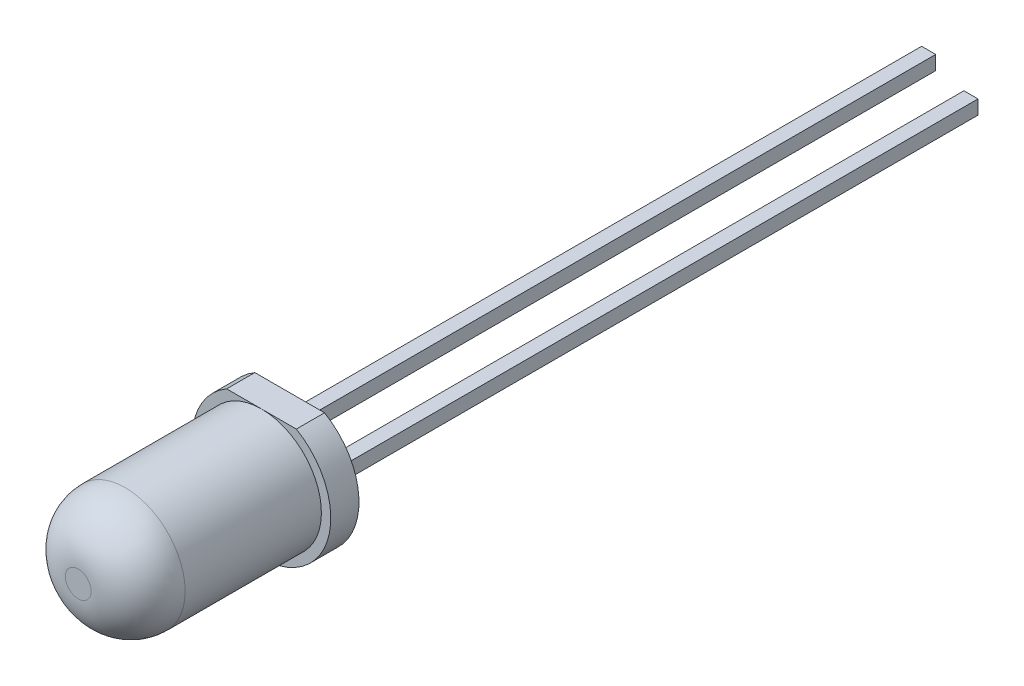
ISO-10303-21;
HEADER;
FILE_DESCRIPTION(('STEP AP214'),'2;1');
FILE_NAME('part.step','',(''),(''),'','','');
FILE_SCHEMA(('AUTOMOTIVE_DESIGN { 1 0 10303 214 1 1 1 1 }'));
ENDSEC;
DATA;
#1=APPLICATION_CONTEXT('core data for automotive mechanical design processes');
#2=APPLICATION_PROTOCOL_DEFINITION('international standard','automotive_design',2000,#1);
#3=PRODUCT_CONTEXT('',#1,'mechanical');
#4=PRODUCT('Part','Part','',(#3));
#5=PRODUCT_RELATED_PRODUCT_CATEGORY('part','',(#4));
#6=PRODUCT_DEFINITION_FORMATION('','',#4);
#7=PRODUCT_DEFINITION_CONTEXT('part definition',#1,'design');
#8=PRODUCT_DEFINITION('design','',#6,#7);
#9=PRODUCT_DEFINITION_SHAPE('','',#8);
#10=(LENGTH_UNIT() NAMED_UNIT(*) SI_UNIT(.MILLI.,.METRE.));
#11=(NAMED_UNIT(*) PLANE_ANGLE_UNIT() SI_UNIT($,.RADIAN.));
#12=(NAMED_UNIT(*) SI_UNIT($,.STERADIAN.) SOLID_ANGLE_UNIT());
#13=UNCERTAINTY_MEASURE_WITH_UNIT(LENGTH_MEASURE(1.E-05),#10,'distance_accuracy_value','');
#14=(GEOMETRIC_REPRESENTATION_CONTEXT(3) GLOBAL_UNCERTAINTY_ASSIGNED_CONTEXT((#13)) GLOBAL_UNIT_ASSIGNED_CONTEXT((#10,
#11,#12)) REPRESENTATION_CONTEXT('',''));
#15=CARTESIAN_POINT('',(0.,0.,0.));
#16=DIRECTION('',(0.,0.,1.));
#17=DIRECTION('',(1.,0.,0.));
#18=AXIS2_PLACEMENT_3D('',#15,#16,#17);
#19=CARTESIAN_POINT('',(-0.25,-0.5,3.3));
#20=DIRECTION('',(0.,0.,1.));
#21=DIRECTION('',(1.,0.,0.));
#22=AXIS2_PLACEMENT_3D('',#19,#20,#21);
#23=PLANE('',#22);
#24=DIRECTION('',(1.,0.,0.));
#25=VECTOR('',#24,1.);
#26=CARTESIAN_POINT('',(-0.25,-0.5,3.3));
#27=LINE('',#26,#25);
#28=CARTESIAN_POINT('',(-0.25,-0.5,3.3));
#29=VERTEX_POINT('',#28);
#30=CARTESIAN_POINT('',(0.25,-0.5,3.3));
#31=VERTEX_POINT('',#30);
#32=EDGE_CURVE('E55',#29,#31,#27,.T.);
#33=ORIENTED_EDGE('',*,*,#32,.T.);
#34=DIRECTION('',(0.,-1.,0.));
#35=VECTOR('',#34,1.);
#36=CARTESIAN_POINT('',(0.25,-0.5,3.3));
#37=LINE('',#36,#35);
#38=CARTESIAN_POINT('',(0.25,0.5,3.3));
#39=VERTEX_POINT('',#38);
#40=EDGE_CURVE('E92',#39,#31,#37,.T.);
#41=ORIENTED_EDGE('',*,*,#40,.F.);
#42=DIRECTION('',(1.,0.,0.));
#43=VECTOR('',#42,1.);
#44=CARTESIAN_POINT('',(-0.25,0.5,3.3));
#45=LINE('',#44,#43);
#46=CARTESIAN_POINT('',(-0.25,0.5,3.3));
#47=VERTEX_POINT('',#46);
#48=EDGE_CURVE('E12',#47,#39,#45,.T.);
#49=ORIENTED_EDGE('',*,*,#48,.F.);
#50=DIRECTION('',(0.,-1.,0.));
#51=VECTOR('',#50,1.);
#52=CARTESIAN_POINT('',(-0.25,-0.5,3.3));
#53=LINE('',#52,#51);
#54=EDGE_CURVE('E93',#47,#29,#53,.T.);
#55=ORIENTED_EDGE('',*,*,#54,.T.);
#56=EDGE_LOOP('',(#33,#41,#49,#55));
#57=FACE_BOUND('',#56,.T.);
#58=ADVANCED_FACE('F52',(#57),#23,.T.);
#59=CARTESIAN_POINT('',(-0.25,0.5,3.1));
#60=DIRECTION('',(0.,1.,0.));
#61=DIRECTION('',(0.,0.,1.));
#62=AXIS2_PLACEMENT_3D('',#59,#60,#61);
#63=PLANE('',#62);
#64=ORIENTED_EDGE('',*,*,#48,.T.);
#65=DIRECTION('',(0.,0.,1.));
#66=VECTOR('',#65,1.);
#67=CARTESIAN_POINT('',(0.25,0.5,3.1));
#68=LINE('',#67,#66);
#69=CARTESIAN_POINT('',(0.25,0.5,3.1));
#70=VERTEX_POINT('',#69);
#71=EDGE_CURVE('E109',#70,#39,#68,.T.);
#72=ORIENTED_EDGE('',*,*,#71,.F.);
#73=DIRECTION('',(1.,0.,0.));
#74=VECTOR('',#73,1.);
#75=CARTESIAN_POINT('',(-0.25,0.5,3.1));
#76=LINE('',#75,#74);
#77=CARTESIAN_POINT('',(-0.25,0.5,3.1));
#78=VERTEX_POINT('',#77);
#79=EDGE_CURVE('E60',#78,#70,#76,.T.);
#80=ORIENTED_EDGE('',*,*,#79,.F.);
#81=DIRECTION('',(0.,0.,1.));
#82=VECTOR('',#81,1.);
#83=CARTESIAN_POINT('',(-0.25,0.5,3.1));
#84=LINE('',#83,#82);
#85=EDGE_CURVE('E98',#78,#47,#84,.T.);
#86=ORIENTED_EDGE('',*,*,#85,.T.);
#87=EDGE_LOOP('',(#64,#72,#80,#86));
#88=FACE_BOUND('',#87,.T.);
#89=ADVANCED_FACE('F124',(#88),#63,.T.);
#90=CARTESIAN_POINT('',(-0.25,-0.5,3.1));
#91=DIRECTION('',(0.,0.,-1.));
#92=DIRECTION('',(-1.,0.,0.));
#93=AXIS2_PLACEMENT_3D('',#90,#91,#92);
#94=PLANE('',#93);
#95=ORIENTED_EDGE('',*,*,#79,.T.);
#96=DIRECTION('',(0.,1.,0.));
#97=VECTOR('',#96,1.);
#98=CARTESIAN_POINT('',(0.25,-0.5,3.1));
#99=LINE('',#98,#97);
#100=CARTESIAN_POINT('',(0.25,-0.5,3.1));
#101=VERTEX_POINT('',#100);
#102=EDGE_CURVE('E105',#101,#70,#99,.T.);
#103=ORIENTED_EDGE('',*,*,#102,.F.);
#104=DIRECTION('',(1.,0.,0.));
#105=VECTOR('',#104,1.);
#106=CARTESIAN_POINT('',(-0.25,-0.5,3.1));
#107=LINE('',#106,#105);
#108=CARTESIAN_POINT('',(-0.25,-0.5,3.1));
#109=VERTEX_POINT('',#108);
#110=EDGE_CURVE('E97',#109,#101,#107,.T.);
#111=ORIENTED_EDGE('',*,*,#110,.F.);
#112=DIRECTION('',(0.,1.,0.));
#113=VECTOR('',#112,1.);
#114=CARTESIAN_POINT('',(-0.25,-0.5,3.1));
#115=LINE('',#114,#113);
#116=EDGE_CURVE('E117',#109,#78,#115,.T.);
#117=ORIENTED_EDGE('',*,*,#116,.T.);
#118=EDGE_LOOP('',(#95,#103,#111,#117));
#119=FACE_BOUND('',#118,.T.);
#120=ADVANCED_FACE('F121',(#119),#94,.T.);
#121=CARTESIAN_POINT('',(-0.25,-0.5,3.1));
#122=DIRECTION('',(0.,-1.,0.));
#123=DIRECTION('',(0.,0.,-1.));
#124=AXIS2_PLACEMENT_3D('',#121,#122,#123);
#125=PLANE('',#124);
#126=ORIENTED_EDGE('',*,*,#110,.T.);
#127=DIRECTION('',(0.,0.,-1.));
#128=VECTOR('',#127,1.);
#129=CARTESIAN_POINT('',(0.25,-0.5,3.1));
#130=LINE('',#129,#128);
#131=EDGE_CURVE('E100',#31,#101,#130,.T.);
#132=ORIENTED_EDGE('',*,*,#131,.F.);
#133=ORIENTED_EDGE('',*,*,#32,.F.);
#134=DIRECTION('',(0.,0.,-1.));
#135=VECTOR('',#134,1.);
#136=CARTESIAN_POINT('',(-0.25,-0.5,3.1));
#137=LINE('',#136,#135);
#138=EDGE_CURVE('E115',#29,#109,#137,.T.);
#139=ORIENTED_EDGE('',*,*,#138,.T.);
#140=EDGE_LOOP('',(#126,#132,#133,#139));
#141=FACE_BOUND('',#140,.T.);
#142=ADVANCED_FACE('F101',(#141),#125,.T.);
#143=CARTESIAN_POINT('',(-0.25,0.,0.));
#144=DIRECTION('',(1.,0.,0.));
#145=DIRECTION('',(0.,0.,-1.));
#146=AXIS2_PLACEMENT_3D('',#143,#144,#145);
#147=PLANE('',#146);
#148=ORIENTED_EDGE('',*,*,#54,.F.);
#149=ORIENTED_EDGE('',*,*,#85,.F.);
#150=ORIENTED_EDGE('',*,*,#116,.F.);
#151=ORIENTED_EDGE('',*,*,#138,.F.);
#152=EDGE_LOOP('',(#148,#149,#150,#151));
#153=FACE_BOUND('',#152,.T.);
#154=ADVANCED_FACE('F126',(#153),#147,.F.);
#155=CARTESIAN_POINT('',(0.25,0.,0.));
#156=DIRECTION('',(1.,0.,0.));
#157=DIRECTION('',(0.,0.,-1.));
#158=AXIS2_PLACEMENT_3D('',#155,#156,#157);
#159=PLANE('',#158);
#160=ORIENTED_EDGE('',*,*,#40,.T.);
#161=ORIENTED_EDGE('',*,*,#131,.T.);
#162=ORIENTED_EDGE('',*,*,#102,.T.);
#163=ORIENTED_EDGE('',*,*,#71,.T.);
#164=EDGE_LOOP('',(#160,#161,#162,#163));
#165=FACE_BOUND('',#164,.T.);
#166=ADVANCED_FACE('F108',(#165),#159,.T.);
#167=CLOSED_SHELL('',(#58,#89,#120,#142,#154,#166));
#168=MANIFOLD_SOLID_BREP('B2',#167);
#169=CARTESIAN_POINT('',(0.,0.,1.2));
#170=DIRECTION('',(0.,0.,-1.));
#171=DIRECTION('',(-1.,0.,0.));
#172=AXIS2_PLACEMENT_3D('',#169,#170,#171);
#173=CYLINDRICAL_SURFACE('',#172,2.95);
#174=CARTESIAN_POINT('',(0.,0.,1.2));
#175=DIRECTION('',(0.,0.,1.));
#176=DIRECTION('',(1.,0.,0.));
#177=AXIS2_PLACEMENT_3D('',#174,#175,#176);
#178=CIRCLE('',#177,2.95);
#179=CARTESIAN_POINT('',(-1.48323969741914,2.55,1.2));
#180=VERTEX_POINT('',#179);
#181=CARTESIAN_POINT('',(1.48323969741914,2.55,1.2));
#182=VERTEX_POINT('',#181);
#183=EDGE_CURVE('E373',#180,#182,#178,.T.);
#184=ORIENTED_EDGE('',*,*,#183,.F.);
#185=DIRECTION('',(0.,0.,-1.));
#186=VECTOR('',#185,1.);
#187=CARTESIAN_POINT('',(-1.48323969741914,2.55,1.2));
#188=LINE('',#187,#186);
#189=CARTESIAN_POINT('',(-1.48323969741914,2.55,0.));
#190=VERTEX_POINT('',#189);
#191=EDGE_CURVE('E363',#180,#190,#188,.T.);
#192=ORIENTED_EDGE('',*,*,#191,.T.);
#193=CARTESIAN_POINT('',(0.,0.,0.));
#194=DIRECTION('',(0.,0.,1.));
#195=DIRECTION('',(1.,0.,0.));
#196=AXIS2_PLACEMENT_3D('',#193,#194,#195);
#197=CIRCLE('',#196,2.95);
#198=CARTESIAN_POINT('',(1.48323969741914,2.55,0.));
#199=VERTEX_POINT('',#198);
#200=EDGE_CURVE('E367',#190,#199,#197,.T.);
#201=ORIENTED_EDGE('',*,*,#200,.T.);
#202=DIRECTION('',(0.,0.,-1.));
#203=VECTOR('',#202,1.);
#204=CARTESIAN_POINT('',(1.48323969741914,2.55,1.2));
#205=LINE('',#204,#203);
#206=EDGE_CURVE('E359',#199,#182,#205,.F.);
#207=ORIENTED_EDGE('',*,*,#206,.T.);
#208=EDGE_LOOP('',(#184,#192,#201,#207));
#209=FACE_BOUND('',#208,.T.);
#210=ADVANCED_FACE('F192',(#209),#173,.T.);
#211=CARTESIAN_POINT('',(0.,0.,1.2));
#212=DIRECTION('',(0.,0.,1.));
#213=DIRECTION('',(1.,0.,0.));
#214=AXIS2_PLACEMENT_3D('',#211,#212,#213);
#215=PLANE('',#214);
#216=DIRECTION('',(1.,0.,0.));
#217=VECTOR('',#216,1.);
#218=CARTESIAN_POINT('',(-2.141777441338,2.55,1.2));
#219=LINE('',#218,#217);
#220=CARTESIAN_POINT('',(0.,2.55,1.2));
#221=VERTEX_POINT('',#220);
#222=EDGE_CURVE('E358',#180,#221,#219,.T.);
#223=ORIENTED_EDGE('',*,*,#222,.F.);
#224=ORIENTED_EDGE('',*,*,#183,.T.);
#225=EDGE_CURVE('E355',#221,#182,#219,.T.);
#226=ORIENTED_EDGE('',*,*,#225,.F.);
#227=CARTESIAN_POINT('',(0.,0.,1.2));
#228=DIRECTION('',(0.,0.,1.));
#229=DIRECTION('',(1.,0.,0.));
#230=AXIS2_PLACEMENT_3D('',#227,#228,#229);
#231=CIRCLE('',#230,2.55);
#232=EDGE_CURVE('E368',#221,#221,#231,.T.);
#233=ORIENTED_EDGE('',*,*,#232,.F.);
#234=EDGE_LOOP('',(#223,#224,#226,#233));
#235=FACE_BOUND('',#234,.T.);
#236=ADVANCED_FACE('F399',(#235),#215,.T.);
#237=CARTESIAN_POINT('',(0.,0.,0.));
#238=DIRECTION('',(0.,0.,1.));
#239=DIRECTION('',(1.,0.,0.));
#240=AXIS2_PLACEMENT_3D('',#237,#238,#239);
#241=PLANE('',#240);
#242=DIRECTION('',(0.,1.,0.));
#243=VECTOR('',#242,1.);
#244=CARTESIAN_POINT('',(0.3,0.97,0.));
#245=LINE('',#244,#243);
#246=CARTESIAN_POINT('',(0.3,0.97,0.));
#247=VERTEX_POINT('',#246);
#248=CARTESIAN_POINT('',(0.3,1.57,0.));
#249=VERTEX_POINT('',#248);
#250=EDGE_CURVE('E290',#247,#249,#245,.T.);
#251=ORIENTED_EDGE('',*,*,#250,.T.);
#252=DIRECTION('',(-1.,0.,0.));
#253=VECTOR('',#252,1.);
#254=CARTESIAN_POINT('',(0.3,1.57,0.));
#255=LINE('',#254,#253);
#256=CARTESIAN_POINT('',(-0.3,1.57,0.));
#257=VERTEX_POINT('',#256);
#258=EDGE_CURVE('E310',#249,#257,#255,.T.);
#259=ORIENTED_EDGE('',*,*,#258,.T.);
#260=DIRECTION('',(0.,1.,0.));
#261=VECTOR('',#260,1.);
#262=CARTESIAN_POINT('',(-0.3,0.97,0.));
#263=LINE('',#262,#261);
#264=CARTESIAN_POINT('',(-0.3,0.97,0.));
#265=VERTEX_POINT('',#264);
#266=EDGE_CURVE('E288',#265,#257,#263,.T.);
#267=ORIENTED_EDGE('',*,*,#266,.F.);
#268=DIRECTION('',(-1.,0.,0.));
#269=VECTOR('',#268,1.);
#270=CARTESIAN_POINT('',(0.3,0.97,0.));
#271=LINE('',#270,#269);
#272=EDGE_CURVE('E295',#247,#265,#271,.T.);
#273=ORIENTED_EDGE('',*,*,#272,.F.);
#274=EDGE_LOOP('',(#251,#259,#267,#273));
#275=FACE_BOUND('',#274,.T.);
#276=DIRECTION('',(0.,-1.,0.));
#277=VECTOR('',#276,1.);
#278=CARTESIAN_POINT('',(0.3,0.,0.));
#279=LINE('',#278,#277);
#280=CARTESIAN_POINT('',(0.3,-0.97,0.));
#281=VERTEX_POINT('',#280);
#282=CARTESIAN_POINT('',(0.3,-1.57,0.));
#283=VERTEX_POINT('',#282);
#284=EDGE_CURVE('E333',#281,#283,#279,.T.);
#285=ORIENTED_EDGE('',*,*,#284,.F.);
#286=DIRECTION('',(-1.,0.,0.));
#287=VECTOR('',#286,1.);
#288=CARTESIAN_POINT('',(0.,-0.97,0.));
#289=LINE('',#288,#287);
#290=CARTESIAN_POINT('',(-0.3,-0.97,0.));
#291=VERTEX_POINT('',#290);
#292=EDGE_CURVE('E313',#281,#291,#289,.T.);
#293=ORIENTED_EDGE('',*,*,#292,.T.);
#294=DIRECTION('',(0.,-1.,0.));
#295=VECTOR('',#294,1.);
#296=CARTESIAN_POINT('',(-0.3,0.,0.));
#297=LINE('',#296,#295);
#298=CARTESIAN_POINT('',(-0.3,-1.57,0.));
#299=VERTEX_POINT('',#298);
#300=EDGE_CURVE('E319',#291,#299,#297,.T.);
#301=ORIENTED_EDGE('',*,*,#300,.T.);
#302=DIRECTION('',(-1.,0.,0.));
#303=VECTOR('',#302,1.);
#304=CARTESIAN_POINT('',(0.,-1.57,0.));
#305=LINE('',#304,#303);
#306=EDGE_CURVE('E336',#283,#299,#305,.T.);
#307=ORIENTED_EDGE('',*,*,#306,.F.);
#308=EDGE_LOOP('',(#285,#293,#301,#307));
#309=FACE_BOUND('',#308,.T.);
#310=ORIENTED_EDGE('',*,*,#200,.F.);
#311=DIRECTION('',(1.,0.,0.));
#312=VECTOR('',#311,1.);
#313=CARTESIAN_POINT('',(0.,2.55,0.));
#314=LINE('',#313,#312);
#315=EDGE_CURVE('E201',#190,#199,#314,.T.);
#316=ORIENTED_EDGE('',*,*,#315,.T.);
#317=EDGE_LOOP('',(#310,#316));
#318=FACE_BOUND('',#317,.T.);
#319=ADVANCED_FACE('F390',(#275,#309,#318),#241,.F.);
#320=CARTESIAN_POINT('',(0.,0.,9.));
#321=DIRECTION('',(0.,0.,-1.));
#322=DIRECTION('',(-1.,0.,0.));
#323=AXIS2_PLACEMENT_3D('',#320,#321,#322);
#324=CYLINDRICAL_SURFACE('',#323,2.55);
#325=CARTESIAN_POINT('',(0.,0.,7.));
#326=DIRECTION('',(0.,0.,1.));
#327=DIRECTION('',(1.,0.,0.));
#328=AXIS2_PLACEMENT_3D('',#325,#326,#327);
#329=CIRCLE('',#328,2.55);
#330=CARTESIAN_POINT('',(2.55,0.,7.));
#331=VERTEX_POINT('',#330);
#332=EDGE_CURVE('E383',#331,#331,#329,.F.);
#333=ORIENTED_EDGE('',*,*,#332,.T.);
#334=EDGE_LOOP('',(#333));
#335=FACE_BOUND('',#334,.T.);
#336=ORIENTED_EDGE('',*,*,#232,.T.);
#337=EDGE_LOOP('',(#336));
#338=FACE_BOUND('',#337,.T.);
#339=ADVANCED_FACE('F402',(#335,#338),#324,.T.);
#340=CARTESIAN_POINT('',(0.,0.,9.));
#341=DIRECTION('',(0.,0.,1.));
#342=DIRECTION('',(1.,0.,0.));
#343=AXIS2_PLACEMENT_3D('',#340,#341,#342);
#344=PLANE('',#343);
#345=CARTESIAN_POINT('',(0.,0.,9.));
#346=DIRECTION('',(0.,0.,1.));
#347=DIRECTION('',(1.,0.,0.));
#348=AXIS2_PLACEMENT_3D('',#345,#346,#347);
#349=CIRCLE('',#348,0.55);
#350=CARTESIAN_POINT('',(0.55,0.,9.));
#351=VERTEX_POINT('',#350);
#352=EDGE_CURVE('E372',#351,#351,#349,.T.);
#353=ORIENTED_EDGE('',*,*,#352,.T.);
#354=EDGE_LOOP('',(#353));
#355=FACE_BOUND('',#354,.T.);
#356=ADVANCED_FACE('F404',(#355),#344,.T.);
#357=CARTESIAN_POINT('',(0.,0.,7.));
#358=DIRECTION('',(0.,0.,1.));
#359=DIRECTION('',(1.,0.,0.));
#360=AXIS2_PLACEMENT_3D('',#357,#358,#359);
#361=DEGENERATE_TOROIDAL_SURFACE('',#360,0.55,2.,.T.);
#362=ORIENTED_EDGE('',*,*,#332,.F.);
#363=EDGE_LOOP('',(#362));
#364=FACE_BOUND('',#363,.T.);
#365=ORIENTED_EDGE('',*,*,#352,.F.);
#366=EDGE_LOOP('',(#365));
#367=FACE_BOUND('',#366,.T.);
#368=ADVANCED_FACE('F194',(#364,#367),#361,.T.);
#369=CARTESIAN_POINT('',(-2.141777441338,2.55,-6.6));
#370=DIRECTION('',(0.,-1.,0.));
#371=DIRECTION('',(0.,0.,-1.));
#372=AXIS2_PLACEMENT_3D('',#369,#370,#371);
#373=PLANE('',#372);
#374=ORIENTED_EDGE('',*,*,#222,.T.);
#375=ORIENTED_EDGE('',*,*,#225,.T.);
#376=ORIENTED_EDGE('',*,*,#206,.F.);
#377=ORIENTED_EDGE('',*,*,#315,.F.);
#378=ORIENTED_EDGE('',*,*,#191,.F.);
#379=EDGE_LOOP('',(#374,#375,#376,#377,#378));
#380=FACE_BOUND('',#379,.T.);
#381=ADVANCED_FACE('F395',(#380),#373,.F.);
#382=CARTESIAN_POINT('',(0.,-0.97,-29.));
#383=DIRECTION('',(0.,1.,0.));
#384=DIRECTION('',(0.,0.,1.));
#385=AXIS2_PLACEMENT_3D('',#382,#383,#384);
#386=PLANE('',#385);
#387=ORIENTED_EDGE('',*,*,#292,.F.);
#388=DIRECTION('',(0.,0.,1.));
#389=VECTOR('',#388,1.);
#390=CARTESIAN_POINT('',(0.3,-0.97,-29.));
#391=LINE('',#390,#389);
#392=CARTESIAN_POINT('',(0.3,-0.97,-29.));
#393=VERTEX_POINT('',#392);
#394=EDGE_CURVE('E352',#393,#281,#391,.T.);
#395=ORIENTED_EDGE('',*,*,#394,.F.);
#396=DIRECTION('',(-1.,0.,0.));
#397=VECTOR('',#396,1.);
#398=CARTESIAN_POINT('',(0.,-0.97,-29.));
#399=LINE('',#398,#397);
#400=CARTESIAN_POINT('',(-0.3,-0.97,-29.));
#401=VERTEX_POINT('',#400);
#402=EDGE_CURVE('E314',#393,#401,#399,.T.);
#403=ORIENTED_EDGE('',*,*,#402,.T.);
#404=DIRECTION('',(0.,0.,1.));
#405=VECTOR('',#404,1.);
#406=CARTESIAN_POINT('',(-0.3,-0.97,-29.));
#407=LINE('',#406,#405);
#408=EDGE_CURVE('E329',#401,#291,#407,.T.);
#409=ORIENTED_EDGE('',*,*,#408,.T.);
#410=EDGE_LOOP('',(#387,#395,#403,#409));
#411=FACE_BOUND('',#410,.T.);
#412=ADVANCED_FACE('F436',(#411),#386,.T.);
#413=CARTESIAN_POINT('',(0.3,0.,-29.));
#414=DIRECTION('',(-1.,0.,0.));
#415=DIRECTION('',(0.,-1.,0.));
#416=AXIS2_PLACEMENT_3D('',#413,#414,#415);
#417=PLANE('',#416);
#418=ORIENTED_EDGE('',*,*,#284,.T.);
#419=DIRECTION('',(0.,0.,1.));
#420=VECTOR('',#419,1.);
#421=CARTESIAN_POINT('',(0.3,-1.57,-29.));
#422=LINE('',#421,#420);
#423=CARTESIAN_POINT('',(0.3,-1.57,-29.));
#424=VERTEX_POINT('',#423);
#425=EDGE_CURVE('E348',#424,#283,#422,.T.);
#426=ORIENTED_EDGE('',*,*,#425,.F.);
#427=DIRECTION('',(0.,-1.,0.));
#428=VECTOR('',#427,1.);
#429=CARTESIAN_POINT('',(0.3,0.,-29.));
#430=LINE('',#429,#428);
#431=EDGE_CURVE('E318',#393,#424,#430,.T.);
#432=ORIENTED_EDGE('',*,*,#431,.F.);
#433=ORIENTED_EDGE('',*,*,#394,.T.);
#434=EDGE_LOOP('',(#418,#426,#432,#433));
#435=FACE_BOUND('',#434,.T.);
#436=ADVANCED_FACE('F441',(#435),#417,.F.);
#437=CARTESIAN_POINT('',(0.,-1.57,-29.));
#438=DIRECTION('',(0.,1.,0.));
#439=DIRECTION('',(0.,0.,1.));
#440=AXIS2_PLACEMENT_3D('',#437,#438,#439);
#441=PLANE('',#440);
#442=ORIENTED_EDGE('',*,*,#306,.T.);
#443=DIRECTION('',(0.,0.,1.));
#444=VECTOR('',#443,1.);
#445=CARTESIAN_POINT('',(-0.3,-1.57,-29.));
#446=LINE('',#445,#444);
#447=CARTESIAN_POINT('',(-0.3,-1.57,-29.));
#448=VERTEX_POINT('',#447);
#449=EDGE_CURVE('E344',#448,#299,#446,.T.);
#450=ORIENTED_EDGE('',*,*,#449,.F.);
#451=DIRECTION('',(-1.,0.,0.));
#452=VECTOR('',#451,1.);
#453=CARTESIAN_POINT('',(0.,-1.57,-29.));
#454=LINE('',#453,#452);
#455=EDGE_CURVE('E322',#424,#448,#454,.T.);
#456=ORIENTED_EDGE('',*,*,#455,.F.);
#457=ORIENTED_EDGE('',*,*,#425,.T.);
#458=EDGE_LOOP('',(#442,#450,#456,#457));
#459=FACE_BOUND('',#458,.T.);
#460=ADVANCED_FACE('F451',(#459),#441,.F.);
#461=CARTESIAN_POINT('',(-0.3,0.,-29.));
#462=DIRECTION('',(-1.,0.,0.));
#463=DIRECTION('',(0.,-1.,0.));
#464=AXIS2_PLACEMENT_3D('',#461,#462,#463);
#465=PLANE('',#464);
#466=ORIENTED_EDGE('',*,*,#300,.F.);
#467=ORIENTED_EDGE('',*,*,#408,.F.);
#468=DIRECTION('',(0.,-1.,0.));
#469=VECTOR('',#468,1.);
#470=CARTESIAN_POINT('',(-0.3,0.,-29.));
#471=LINE('',#470,#469);
#472=EDGE_CURVE('E325',#401,#448,#471,.T.);
#473=ORIENTED_EDGE('',*,*,#472,.T.);
#474=ORIENTED_EDGE('',*,*,#449,.T.);
#475=EDGE_LOOP('',(#466,#467,#473,#474));
#476=FACE_BOUND('',#475,.T.);
#477=ADVANCED_FACE('F461',(#476),#465,.T.);
#478=CARTESIAN_POINT('',(0.,0.,-29.));
#479=DIRECTION('',(0.,0.,-1.));
#480=DIRECTION('',(-1.,0.,0.));
#481=AXIS2_PLACEMENT_3D('',#478,#479,#480);
#482=PLANE('',#481);
#483=ORIENTED_EDGE('',*,*,#402,.F.);
#484=ORIENTED_EDGE('',*,*,#431,.T.);
#485=ORIENTED_EDGE('',*,*,#455,.T.);
#486=ORIENTED_EDGE('',*,*,#472,.F.);
#487=EDGE_LOOP('',(#483,#484,#485,#486));
#488=FACE_BOUND('',#487,.T.);
#489=ADVANCED_FACE('F471',(#488),#482,.T.);
#490=CARTESIAN_POINT('',(0.3,1.57,-29.));
#491=DIRECTION('',(0.,1.,0.));
#492=DIRECTION('',(0.,0.,1.));
#493=AXIS2_PLACEMENT_3D('',#490,#491,#492);
#494=PLANE('',#493);
#495=DIRECTION('',(1.,0.,0.));
#496=VECTOR('',#495,1.);
#497=CARTESIAN_POINT('',(0.3,1.57,-27.2));
#498=LINE('',#497,#496);
#499=CARTESIAN_POINT('',(-0.3,1.57,-27.2));
#500=VERTEX_POINT('',#499);
#501=CARTESIAN_POINT('',(0.3,1.57,-27.2));
#502=VERTEX_POINT('',#501);
#503=EDGE_CURVE('E273',#500,#502,#498,.T.);
#504=ORIENTED_EDGE('',*,*,#503,.F.);
#505=DIRECTION('',(0.,0.,1.));
#506=VECTOR('',#505,1.);
#507=CARTESIAN_POINT('',(-0.3,1.57,-29.));
#508=LINE('',#507,#506);
#509=EDGE_CURVE('E280',#500,#257,#508,.T.);
#510=ORIENTED_EDGE('',*,*,#509,.T.);
#511=ORIENTED_EDGE('',*,*,#258,.F.);
#512=DIRECTION('',(0.,0.,1.));
#513=VECTOR('',#512,1.);
#514=CARTESIAN_POINT('',(0.3,1.57,-29.));
#515=LINE('',#514,#513);
#516=EDGE_CURVE('E215',#502,#249,#515,.T.);
#517=ORIENTED_EDGE('',*,*,#516,.F.);
#518=EDGE_LOOP('',(#504,#510,#511,#517));
#519=FACE_BOUND('',#518,.T.);
#520=ADVANCED_FACE('F278',(#519),#494,.T.);
#521=CARTESIAN_POINT('',(0.3,0.97,-29.));
#522=DIRECTION('',(1.,0.,0.));
#523=DIRECTION('',(0.,1.,0.));
#524=AXIS2_PLACEMENT_3D('',#521,#522,#523);
#525=PLANE('',#524);
#526=DIRECTION('',(0.,-1.,0.));
#527=VECTOR('',#526,1.);
#528=CARTESIAN_POINT('',(0.3,0.97,-27.2));
#529=LINE('',#528,#527);
#530=CARTESIAN_POINT('',(0.3,0.97,-27.2));
#531=VERTEX_POINT('',#530);
#532=EDGE_CURVE('E283',#502,#531,#529,.T.);
#533=ORIENTED_EDGE('',*,*,#532,.F.);
#534=ORIENTED_EDGE('',*,*,#516,.T.);
#535=ORIENTED_EDGE('',*,*,#250,.F.);
#536=DIRECTION('',(0.,0.,1.));
#537=VECTOR('',#536,1.);
#538=CARTESIAN_POINT('',(0.3,0.97,-29.));
#539=LINE('',#538,#537);
#540=EDGE_CURVE('E297',#531,#247,#539,.T.);
#541=ORIENTED_EDGE('',*,*,#540,.F.);
#542=EDGE_LOOP('',(#533,#534,#535,#541));
#543=FACE_BOUND('',#542,.T.);
#544=ADVANCED_FACE('F490',(#543),#525,.T.);
#545=CARTESIAN_POINT('',(0.3,0.97,-29.));
#546=DIRECTION('',(0.,1.,0.));
#547=DIRECTION('',(0.,0.,1.));
#548=AXIS2_PLACEMENT_3D('',#545,#546,#547);
#549=PLANE('',#548);
#550=DIRECTION('',(0.,0.,1.));
#551=VECTOR('',#550,1.);
#552=CARTESIAN_POINT('',(-0.3,0.97,-29.));
#553=LINE('',#552,#551);
#554=CARTESIAN_POINT('',(-0.3,0.97,-27.2));
#555=VERTEX_POINT('',#554);
#556=EDGE_CURVE('E291',#555,#265,#553,.T.);
#557=ORIENTED_EDGE('',*,*,#556,.F.);
#558=DIRECTION('',(1.,0.,0.));
#559=VECTOR('',#558,1.);
#560=CARTESIAN_POINT('',(0.3,0.97,-27.2));
#561=LINE('',#560,#559);
#562=EDGE_CURVE('E208',#555,#531,#561,.T.);
#563=ORIENTED_EDGE('',*,*,#562,.T.);
#564=ORIENTED_EDGE('',*,*,#540,.T.);
#565=ORIENTED_EDGE('',*,*,#272,.T.);
#566=EDGE_LOOP('',(#557,#563,#564,#565));
#567=FACE_BOUND('',#566,.T.);
#568=ADVANCED_FACE('F499',(#567),#549,.F.);
#569=CARTESIAN_POINT('',(-0.3,0.97,-29.));
#570=DIRECTION('',(1.,0.,0.));
#571=DIRECTION('',(0.,1.,0.));
#572=AXIS2_PLACEMENT_3D('',#569,#570,#571);
#573=PLANE('',#572);
#574=ORIENTED_EDGE('',*,*,#509,.F.);
#575=DIRECTION('',(0.,-1.,0.));
#576=VECTOR('',#575,1.);
#577=CARTESIAN_POINT('',(-0.3,0.97,-27.2));
#578=LINE('',#577,#576);
#579=EDGE_CURVE('E50',#500,#555,#578,.T.);
#580=ORIENTED_EDGE('',*,*,#579,.T.);
#581=ORIENTED_EDGE('',*,*,#556,.T.);
#582=ORIENTED_EDGE('',*,*,#266,.T.);
#583=EDGE_LOOP('',(#574,#580,#581,#582));
#584=FACE_BOUND('',#583,.T.);
#585=ADVANCED_FACE('F286',(#584),#573,.F.);
#586=CARTESIAN_POINT('',(0.,0.,-27.2));
#587=DIRECTION('',(0.,0.,1.));
#588=DIRECTION('',(1.,0.,0.));
#589=AXIS2_PLACEMENT_3D('',#586,#587,#588);
#590=PLANE('',#589);
#591=ORIENTED_EDGE('',*,*,#503,.T.);
#592=ORIENTED_EDGE('',*,*,#532,.T.);
#593=ORIENTED_EDGE('',*,*,#562,.F.);
#594=ORIENTED_EDGE('',*,*,#579,.F.);
#595=EDGE_LOOP('',(#591,#592,#593,#594));
#596=FACE_BOUND('',#595,.T.);
#597=ADVANCED_FACE('F272',(#596),#590,.F.);
#598=CLOSED_SHELL('',(#210,#236,#319,#339,#356,#368,#381,#412,#436,#460,#477,#489,#520,#544,
#568,#585,#597));
#599=MANIFOLD_SOLID_BREP('B6',#598);
#600=ADVANCED_BREP_SHAPE_REPRESENTATION('',(#18,#168,#599),#14);
#601=SHAPE_DEFINITION_REPRESENTATION(#9,#600);
ENDSEC;
END-ISO-10303-21;
